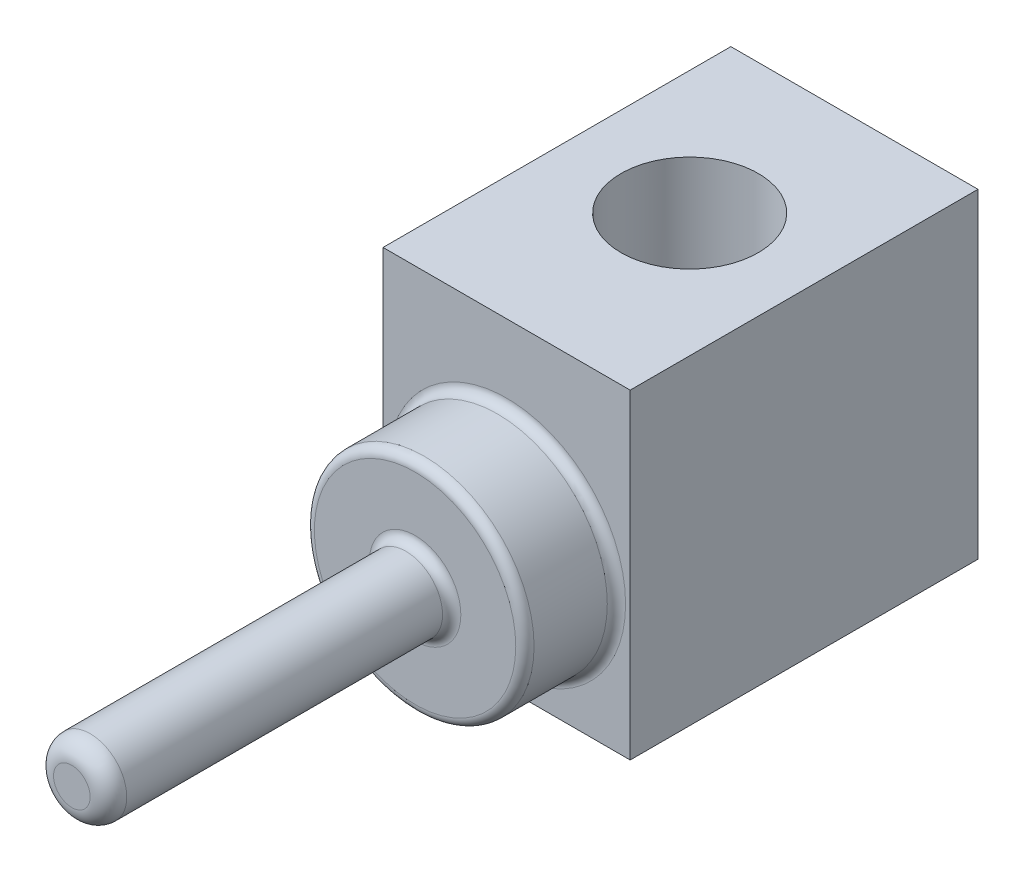
ISO-10303-21;
HEADER;
FILE_DESCRIPTION(('STEP AP214'),'2;1');
FILE_NAME('part.step','',(''),(''),'','','');
FILE_SCHEMA(('AUTOMOTIVE_DESIGN { 1 0 10303 214 1 1 1 1 }'));
ENDSEC;
DATA;
#1=APPLICATION_CONTEXT('core data for automotive mechanical design processes');
#2=APPLICATION_PROTOCOL_DEFINITION('international standard','automotive_design',2000,#1);
#3=PRODUCT_CONTEXT('',#1,'mechanical');
#4=PRODUCT('Part','Part','',(#3));
#5=PRODUCT_RELATED_PRODUCT_CATEGORY('part','',(#4));
#6=PRODUCT_DEFINITION_FORMATION('','',#4);
#7=PRODUCT_DEFINITION_CONTEXT('part definition',#1,'design');
#8=PRODUCT_DEFINITION('design','',#6,#7);
#9=PRODUCT_DEFINITION_SHAPE('','',#8);
#10=(LENGTH_UNIT() NAMED_UNIT(*) SI_UNIT(.MILLI.,.METRE.));
#11=(NAMED_UNIT(*) PLANE_ANGLE_UNIT() SI_UNIT($,.RADIAN.));
#12=(NAMED_UNIT(*) SI_UNIT($,.STERADIAN.) SOLID_ANGLE_UNIT());
#13=UNCERTAINTY_MEASURE_WITH_UNIT(LENGTH_MEASURE(1.E-05),#10,'distance_accuracy_value','');
#14=(GEOMETRIC_REPRESENTATION_CONTEXT(3) GLOBAL_UNCERTAINTY_ASSIGNED_CONTEXT((#13)) GLOBAL_UNIT_ASSIGNED_CONTEXT((#10,
#11,#12)) REPRESENTATION_CONTEXT('',''));
#15=CARTESIAN_POINT('',(0.,0.,0.));
#16=DIRECTION('',(0.,0.,1.));
#17=DIRECTION('',(1.,0.,0.));
#18=AXIS2_PLACEMENT_3D('',#15,#16,#17);
#19=CARTESIAN_POINT('',(0.,-0.3,1.));
#20=DIRECTION('',(0.,0.,1.));
#21=DIRECTION('',(1.,0.,0.));
#22=AXIS2_PLACEMENT_3D('',#19,#20,#21);
#23=PLANE('',#22);
#24=CARTESIAN_POINT('',(0.,-0.3,1.));
#25=DIRECTION('',(0.,0.,1.));
#26=DIRECTION('',(1.,0.,0.));
#27=AXIS2_PLACEMENT_3D('',#24,#25,#26);
#28=CIRCLE('',#27,0.5);
#29=CARTESIAN_POINT('',(0.5,-0.3,1.));
#30=VERTEX_POINT('',#29);
#31=EDGE_CURVE('E166',#30,#30,#28,.F.);
#32=ORIENTED_EDGE('',*,*,#31,.T.);
#33=EDGE_LOOP('',(#32));
#34=FACE_BOUND('',#33,.T.);
#35=CARTESIAN_POINT('',(0.,-0.3,1.));
#36=DIRECTION('',(0.,0.,1.));
#37=DIRECTION('',(1.,0.,0.));
#38=AXIS2_PLACEMENT_3D('',#35,#36,#37);
#39=CIRCLE('',#38,1.1);
#40=CARTESIAN_POINT('',(1.1,-0.3,1.));
#41=VERTEX_POINT('',#40);
#42=EDGE_CURVE('E117',#41,#41,#39,.T.);
#43=ORIENTED_EDGE('',*,*,#42,.T.);
#44=EDGE_LOOP('',(#43));
#45=FACE_BOUND('',#44,.T.);
#46=ADVANCED_FACE('F37',(#34,#45),#23,.T.);
#47=CARTESIAN_POINT('',(0.,0.,0.));
#48=DIRECTION('',(0.,0.,1.));
#49=DIRECTION('',(1.,0.,0.));
#50=AXIS2_PLACEMENT_3D('',#47,#48,#49);
#51=PLANE('',#50);
#52=CARTESIAN_POINT('',(0.,-0.3,0.));
#53=DIRECTION('',(0.,0.,1.));
#54=DIRECTION('',(1.,0.,0.));
#55=AXIS2_PLACEMENT_3D('',#52,#53,#54);
#56=CIRCLE('',#55,1.3);
#57=CARTESIAN_POINT('',(1.3,-0.3,0.));
#58=VERTEX_POINT('',#57);
#59=EDGE_CURVE('E173',#58,#58,#56,.F.);
#60=ORIENTED_EDGE('',*,*,#59,.T.);
#61=EDGE_LOOP('',(#60));
#62=FACE_BOUND('',#61,.T.);
#63=DIRECTION('',(0.,1.,0.));
#64=VECTOR('',#63,1.);
#65=CARTESIAN_POINT('',(1.35,1.75,0.));
#66=LINE('',#65,#64);
#67=CARTESIAN_POINT('',(1.35,-1.75,0.));
#68=VERTEX_POINT('',#67);
#69=CARTESIAN_POINT('',(1.35,1.75,0.));
#70=VERTEX_POINT('',#69);
#71=EDGE_CURVE('E109',#68,#70,#66,.T.);
#72=ORIENTED_EDGE('',*,*,#71,.T.);
#73=DIRECTION('',(-1.,0.,0.));
#74=VECTOR('',#73,1.);
#75=CARTESIAN_POINT('',(-1.35,1.75,0.));
#76=LINE('',#75,#74);
#77=CARTESIAN_POINT('',(-1.35,1.75,0.));
#78=VERTEX_POINT('',#77);
#79=EDGE_CURVE('E111',#70,#78,#76,.T.);
#80=ORIENTED_EDGE('',*,*,#79,.T.);
#81=DIRECTION('',(0.,-1.,0.));
#82=VECTOR('',#81,1.);
#83=CARTESIAN_POINT('',(-1.35,1.75,0.));
#84=LINE('',#83,#82);
#85=CARTESIAN_POINT('',(-1.35,-1.75,0.));
#86=VERTEX_POINT('',#85);
#87=EDGE_CURVE('E72',#78,#86,#84,.T.);
#88=ORIENTED_EDGE('',*,*,#87,.T.);
#89=DIRECTION('',(1.,0.,0.));
#90=VECTOR('',#89,1.);
#91=CARTESIAN_POINT('',(-1.35,-1.75,0.));
#92=LINE('',#91,#90);
#93=EDGE_CURVE('E104',#86,#68,#92,.T.);
#94=ORIENTED_EDGE('',*,*,#93,.T.);
#95=EDGE_LOOP('',(#72,#80,#88,#94));
#96=FACE_BOUND('',#95,.T.);
#97=ADVANCED_FACE('F148',(#62,#96),#51,.T.);
#98=CARTESIAN_POINT('',(1.35,1.75,-3.8));
#99=DIRECTION('',(1.,0.,0.));
#100=DIRECTION('',(0.,1.,0.));
#101=AXIS2_PLACEMENT_3D('',#98,#99,#100);
#102=PLANE('',#101);
#103=DIRECTION('',(0.,0.,1.));
#104=VECTOR('',#103,1.);
#105=CARTESIAN_POINT('',(1.35,1.75,-3.8));
#106=LINE('',#105,#104);
#107=CARTESIAN_POINT('',(1.35,1.75,-3.8));
#108=VERTEX_POINT('',#107);
#109=EDGE_CURVE('E93',#108,#70,#106,.T.);
#110=ORIENTED_EDGE('',*,*,#109,.T.);
#111=ORIENTED_EDGE('',*,*,#71,.F.);
#112=DIRECTION('',(0.,0.,1.));
#113=VECTOR('',#112,1.);
#114=CARTESIAN_POINT('',(1.35,-1.75,-3.8));
#115=LINE('',#114,#113);
#116=CARTESIAN_POINT('',(1.35,-1.75,-3.8));
#117=VERTEX_POINT('',#116);
#118=EDGE_CURVE('E54',#117,#68,#115,.T.);
#119=ORIENTED_EDGE('',*,*,#118,.F.);
#120=DIRECTION('',(0.,1.,0.));
#121=VECTOR('',#120,1.);
#122=CARTESIAN_POINT('',(1.35,1.75,-3.8));
#123=LINE('',#122,#121);
#124=EDGE_CURVE('E80',#117,#108,#123,.T.);
#125=ORIENTED_EDGE('',*,*,#124,.T.);
#126=EDGE_LOOP('',(#110,#111,#119,#125));
#127=FACE_BOUND('',#126,.T.);
#128=ADVANCED_FACE('F198',(#127),#102,.T.);
#129=CARTESIAN_POINT('',(-1.35,-1.75,-3.8));
#130=DIRECTION('',(0.,-1.,0.));
#131=DIRECTION('',(0.,0.,-1.));
#132=AXIS2_PLACEMENT_3D('',#129,#130,#131);
#133=PLANE('',#132);
#134=ORIENTED_EDGE('',*,*,#93,.F.);
#135=DIRECTION('',(0.,0.,1.));
#136=VECTOR('',#135,1.);
#137=CARTESIAN_POINT('',(-1.35,-1.75,-3.8));
#138=LINE('',#137,#136);
#139=CARTESIAN_POINT('',(-1.35,-1.75,-3.8));
#140=VERTEX_POINT('',#139);
#141=EDGE_CURVE('E92',#140,#86,#138,.T.);
#142=ORIENTED_EDGE('',*,*,#141,.F.);
#143=DIRECTION('',(1.,0.,0.));
#144=VECTOR('',#143,1.);
#145=CARTESIAN_POINT('',(-1.35,-1.75,-3.8));
#146=LINE('',#145,#144);
#147=EDGE_CURVE('E100',#140,#117,#146,.T.);
#148=ORIENTED_EDGE('',*,*,#147,.T.);
#149=ORIENTED_EDGE('',*,*,#118,.T.);
#150=EDGE_LOOP('',(#134,#142,#148,#149));
#151=FACE_BOUND('',#150,.T.);
#152=ADVANCED_FACE('F201',(#151),#133,.T.);
#153=CARTESIAN_POINT('',(-1.35,1.75,-3.8));
#154=DIRECTION('',(-1.,0.,0.));
#155=DIRECTION('',(0.,-1.,0.));
#156=AXIS2_PLACEMENT_3D('',#153,#154,#155);
#157=PLANE('',#156);
#158=DIRECTION('',(0.,-1.,0.));
#159=VECTOR('',#158,1.);
#160=CARTESIAN_POINT('',(-1.35,1.75,-3.8));
#161=LINE('',#160,#159);
#162=CARTESIAN_POINT('',(-1.35,1.75,-3.8));
#163=VERTEX_POINT('',#162);
#164=EDGE_CURVE('E87',#163,#140,#161,.T.);
#165=ORIENTED_EDGE('',*,*,#164,.T.);
#166=ORIENTED_EDGE('',*,*,#141,.T.);
#167=ORIENTED_EDGE('',*,*,#87,.F.);
#168=DIRECTION('',(0.,0.,1.));
#169=VECTOR('',#168,1.);
#170=CARTESIAN_POINT('',(-1.35,1.75,-3.8));
#171=LINE('',#170,#169);
#172=EDGE_CURVE('E84',#163,#78,#171,.T.);
#173=ORIENTED_EDGE('',*,*,#172,.F.);
#174=EDGE_LOOP('',(#165,#166,#167,#173));
#175=FACE_BOUND('',#174,.T.);
#176=ADVANCED_FACE('F86',(#175),#157,.T.);
#177=CARTESIAN_POINT('',(-1.35,1.75,-3.8));
#178=DIRECTION('',(0.,1.,0.));
#179=DIRECTION('',(0.,0.,1.));
#180=AXIS2_PLACEMENT_3D('',#177,#178,#179);
#181=PLANE('',#180);
#182=CARTESIAN_POINT('',(0.,1.75,-2.));
#183=DIRECTION('',(0.,1.,0.));
#184=DIRECTION('',(0.,0.,1.));
#185=AXIS2_PLACEMENT_3D('',#182,#183,#184);
#186=CIRCLE('',#185,0.75);
#187=CARTESIAN_POINT('',(0.,1.75,-1.25));
#188=VERTEX_POINT('',#187);
#189=EDGE_CURVE('E127',#188,#188,#186,.T.);
#190=ORIENTED_EDGE('',*,*,#189,.F.);
#191=EDGE_LOOP('',(#190));
#192=FACE_BOUND('',#191,.T.);
#193=ORIENTED_EDGE('',*,*,#79,.F.);
#194=ORIENTED_EDGE('',*,*,#109,.F.);
#195=DIRECTION('',(-1.,0.,0.));
#196=VECTOR('',#195,1.);
#197=CARTESIAN_POINT('',(-1.35,1.75,-3.8));
#198=LINE('',#197,#196);
#199=EDGE_CURVE('E99',#108,#163,#198,.T.);
#200=ORIENTED_EDGE('',*,*,#199,.T.);
#201=ORIENTED_EDGE('',*,*,#172,.T.);
#202=EDGE_LOOP('',(#193,#194,#200,#201));
#203=FACE_BOUND('',#202,.T.);
#204=ADVANCED_FACE('F102',(#192,#203),#181,.T.);
#205=CARTESIAN_POINT('',(0.,0.,-3.8));
#206=DIRECTION('',(0.,0.,1.));
#207=DIRECTION('',(1.,0.,0.));
#208=AXIS2_PLACEMENT_3D('',#205,#206,#207);
#209=PLANE('',#208);
#210=CARTESIAN_POINT('',(0.,-0.3,-3.8));
#211=DIRECTION('',(0.,0.,1.));
#212=DIRECTION('',(1.,0.,0.));
#213=AXIS2_PLACEMENT_3D('',#210,#211,#212);
#214=CIRCLE('',#213,1.);
#215=CARTESIAN_POINT('',(1.,-0.3,-3.8));
#216=VERTEX_POINT('',#215);
#217=EDGE_CURVE('E112',#216,#216,#214,.T.);
#218=ORIENTED_EDGE('',*,*,#217,.T.);
#219=EDGE_LOOP('',(#218));
#220=FACE_BOUND('',#219,.T.);
#221=ORIENTED_EDGE('',*,*,#199,.F.);
#222=ORIENTED_EDGE('',*,*,#124,.F.);
#223=ORIENTED_EDGE('',*,*,#147,.F.);
#224=ORIENTED_EDGE('',*,*,#164,.F.);
#225=EDGE_LOOP('',(#221,#222,#223,#224));
#226=FACE_BOUND('',#225,.T.);
#227=ADVANCED_FACE('F98',(#220,#226),#209,.F.);
#228=CARTESIAN_POINT('',(0.,-0.3,-3.8));
#229=DIRECTION('',(0.,0.,1.));
#230=DIRECTION('',(1.,0.,0.));
#231=AXIS2_PLACEMENT_3D('',#228,#229,#230);
#232=CYLINDRICAL_SURFACE('',#231,1.);
#233=CARTESIAN_POINT('',(0.,0.7,-1.25));
#234=CARTESIAN_POINT('',(0.0366202144012363,0.699995549924329,-1.25000473534807));
#235=CARTESIAN_POINT('',(0.0732831719538211,0.697967650692158,-1.25270313962658));
#236=CARTESIAN_POINT('',(0.145465550551888,0.690033614797004,-1.26333290268625));
#237=CARTESIAN_POINT('',(0.180981860536906,0.684117727976345,-1.27127741771765));
#238=CARTESIAN_POINT('',(0.249618016635631,0.668978221133335,-1.29185662173774));
#239=CARTESIAN_POINT('',(0.282750996692572,0.659774718373225,-1.30446280168529));
#240=CARTESIAN_POINT('',(0.346210978824908,0.638752824883222,-1.33377112720603));
#241=CARTESIAN_POINT('',(0.376538798175682,0.626935199195139,-1.35047207457087));
#242=CARTESIAN_POINT('',(0.436733026399872,0.600247710135603,-1.38913151948125));
#243=CARTESIAN_POINT('',(0.466296630176021,0.585196539347365,-1.41143366835905));
#244=CARTESIAN_POINT('',(0.521513568274128,0.553835092817011,-1.45974791498282));
#245=CARTESIAN_POINT('',(0.547160736840208,0.537522891380569,-1.48576574032586));
#246=CARTESIAN_POINT('',(0.599185812622842,0.501355617071726,-1.54679147793153));
#247=CARTESIAN_POINT('',(0.624652893542543,0.481454274009925,-1.58255183890201));
#248=CARTESIAN_POINT('',(0.669309989447192,0.443557223633513,-1.65872550584258));
#249=CARTESIAN_POINT('',(0.688508584605921,0.425558934483913,-1.69913234842712));
#250=CARTESIAN_POINT('',(0.71440313926206,0.399885775857877,-1.76975141938605));
#251=CARTESIAN_POINT('',(0.723128372337555,0.390788755925942,-1.79869534857622));
#252=CARTESIAN_POINT('',(0.737103362769485,0.375857970761133,-1.85819636738046));
#253=CARTESIAN_POINT('',(0.742361076759834,0.370016739542133,-1.88874958893716));
#254=CARTESIAN_POINT('',(0.749064110723876,0.362518798434896,-1.95109129276563));
#255=CARTESIAN_POINT('',(0.750474774282209,0.360900133439581,-1.98288840335078));
#256=CARTESIAN_POINT('',(0.749241066198164,0.362297658823725,-2.04630745545204));
#257=CARTESIAN_POINT('',(0.746595240758686,0.365315510876204,-2.07792933008898));
#258=CARTESIAN_POINT('',(0.737988696485991,0.374838116502368,-2.13659567366212));
#259=CARTESIAN_POINT('',(0.732412431994231,0.380935785974531,-2.16376818535869));
#260=CARTESIAN_POINT('',(0.718528355694913,0.395570964919252,-2.21671943919577));
#261=CARTESIAN_POINT('',(0.710217918434353,0.404110818431617,-2.24249681386061));
#262=CARTESIAN_POINT('',(0.685165320811544,0.42870884610599,-2.30812819341289));
#263=CARTESIAN_POINT('',(0.666400742456174,0.446128245598029,-2.34670020834748));
#264=CARTESIAN_POINT('',(0.623090116586354,0.482666490824355,-2.41959826190876));
#265=CARTESIAN_POINT('',(0.598530021283118,0.501789394457194,-2.45391366962035));
#266=CARTESIAN_POINT('',(0.543258020506854,0.540258361538407,-2.51887669520899));
#267=CARTESIAN_POINT('',(0.512406877629166,0.559597933643939,-2.54941030344265));
#268=CARTESIAN_POINT('',(0.445211260855806,0.596240189912107,-2.60513182338868));
#269=CARTESIAN_POINT('',(0.408877527147119,0.61354674132054,-2.63032996011473));
#270=CARTESIAN_POINT('',(0.338951040226875,0.641398630366826,-2.66999039962053));
#271=CARTESIAN_POINT('',(0.306269935092756,0.652603854724669,-2.68559229710799));
#272=CARTESIAN_POINT('',(0.238176086601093,0.67186452208511,-2.71211244023183));
#273=CARTESIAN_POINT('',(0.202765070531895,0.679921937521858,-2.72303361924961));
#274=CARTESIAN_POINT('',(0.129838116241743,0.692227943179846,-2.73962668144325));
#275=CARTESIAN_POINT('',(0.092310640702966,0.696452964858719,-2.74526608946932));
#276=CARTESIAN_POINT('',(0.0166006198984609,0.70057941829725,-2.75077479868585));
#277=CARTESIAN_POINT('',(-0.0215816421863622,0.700482674227045,-2.75064653434768));
#278=CARTESIAN_POINT('',(-0.093402108664815,0.69621273587936,-2.74494456536341));
#279=CARTESIAN_POINT('',(-0.127111163773068,0.692450433002003,-2.73991973155566));
#280=CARTESIAN_POINT('',(-0.19305533530456,0.68175660100794,-2.72551310999607));
#281=CARTESIAN_POINT('',(-0.225290136493632,0.674824397536309,-2.71613039515529));
#282=CARTESIAN_POINT('',(-0.288708389844886,0.657999153416566,-2.69305623470345));
#283=CARTESIAN_POINT('',(-0.319814586268069,0.648010251450967,-2.6792244092863));
#284=CARTESIAN_POINT('',(-0.379259263521539,0.625834927059812,-2.6479137722872));
#285=CARTESIAN_POINT('',(-0.407597360668208,0.613648200660336,-2.63043445618013));
#286=CARTESIAN_POINT('',(-0.465755813159513,0.585595734432497,-2.58910837679472));
#287=CARTESIAN_POINT('',(-0.495033381349327,0.569455475125192,-2.56468573028126));
#288=CARTESIAN_POINT('',(-0.549359874279295,0.536194764373915,-2.51199562370581));
#289=CARTESIAN_POINT('',(-0.574399152347978,0.519072192536943,-2.48371965015335));
#290=CARTESIAN_POINT('',(-0.62438770537802,0.481845641457518,-2.41792505951937));
#291=CARTESIAN_POINT('',(-0.648415218243071,0.461793592600648,-2.37967121925368));
#292=CARTESIAN_POINT('',(-0.689616179991866,0.424702956742105,-2.29831996101394));
#293=CARTESIAN_POINT('',(-0.706810002579291,0.407655497854296,-2.25523743904634));
#294=CARTESIAN_POINT('',(-0.728078671282801,0.385594389043247,-2.18229277556238));
#295=CARTESIAN_POINT('',(-0.734655047561809,0.378479059123847,-2.15380443679764));
#296=CARTESIAN_POINT('',(-0.744457610912695,0.367710280514029,-2.09564647650957));
#297=CARTESIAN_POINT('',(-0.747691276007807,0.364049106097411,-2.06597964660315));
#298=CARTESIAN_POINT('',(-0.750576601033655,0.360788008964814,-2.00608546009004));
#299=CARTESIAN_POINT('',(-0.750210076582722,0.361208703438968,-1.97585602847917));
#300=CARTESIAN_POINT('',(-0.74588441923474,0.36608224270422,-1.91597158063999));
#301=CARTESIAN_POINT('',(-0.741920650285916,0.370540290734719,-1.88631735611138));
#302=CARTESIAN_POINT('',(-0.729469208900039,0.384086744053065,-1.8220427142215));
#303=CARTESIAN_POINT('',(-0.720182838954333,0.393973530017116,-1.78775140963312));
#304=CARTESIAN_POINT('',(-0.697348137148892,0.416914816662478,-1.72173257588601));
#305=CARTESIAN_POINT('',(-0.683789039566413,0.42997729973955,-1.69001178011397));
#306=CARTESIAN_POINT('',(-0.647494590522783,0.462582387984412,-1.61873968323072));
#307=CARTESIAN_POINT('',(-0.62320769235656,0.482801021766621,-1.58028920200535));
#308=CARTESIAN_POINT('',(-0.568253610319043,0.52356754509007,-1.50843698413391));
#309=CARTESIAN_POINT('',(-0.53758074162965,0.54411571283823,-1.47503979200132));
#310=CARTESIAN_POINT('',(-0.469813504073434,0.583644966812501,-1.41358405367889));
#311=CARTESIAN_POINT('',(-0.432668324359605,0.602611751461281,-1.38557174591106));
#312=CARTESIAN_POINT('',(-0.35257980527157,0.636786365634487,-1.33638856860002));
#313=CARTESIAN_POINT('',(-0.309650664114993,0.652003149546709,-1.31520136389219));
#314=CARTESIAN_POINT('',(-0.232419470733686,0.673183741180643,-1.28610004121395));
#315=CARTESIAN_POINT('',(-0.19927463266858,0.680552315625429,-1.27611583370066));
#316=CARTESIAN_POINT('',(-0.131422973804692,0.691917998699978,-1.26079184705597));
#317=CARTESIAN_POINT('',(-0.0967208035042929,0.695924522226515,-1.25543909693557));
#318=CARTESIAN_POINT('',(-0.0412269601856745,0.699363449511954,-1.25084873150009));
#319=CARTESIAN_POINT('',(-0.020620256240996,0.70000250576634,-1.24999733360134));
#320=CARTESIAN_POINT('',(0.,0.7,-1.25));
#321=B_SPLINE_CURVE_WITH_KNOTS('',3,(#233,#234,#235,#236,#237,#238,#239,#240,#241,#242,#243,
#244,#245,#246,#247,#248,#249,#250,#251,#252,#253,#254,#255,#256,#257,#258,#259,#260,#261,#262,
#263,#264,#265,#266,#267,#268,#269,#270,#271,#272,#273,#274,#275,#276,#277,#278,#279,#280,#281,
#282,#283,#284,#285,#286,#287,#288,#289,#290,#291,#292,#293,#294,#295,#296,#297,#298,#299,#300,
#301,#302,#303,#304,#305,#306,#307,#308,#309,#310,#311,#312,#313,#314,#315,#316,#317,#318,#319,
#320),.UNSPECIFIED.,.T.,.F.,(4,2,2,2,2,2,2,2,2,2,2,2,2,2,2,2,2,2,2,2,2,2,2,2,2,2,2,2,2,2,2,2,2,
2,2,2,2,2,2,2,2,2,2,4),(0.,0.109785893286021,0.219848159711622,0.329248166786691,
0.438616199424646,0.558112156587148,0.677794342025812,0.821800079437255,0.965607870282533,
1.05999759264951,1.15416996597645,1.24918793810628,1.34423997150105,1.42913445078177,
1.51411068794507,1.65224665897142,1.79072096173131,1.93267941963232,2.07436331241032,
2.18763252497381,2.30083064815745,2.41472029077636,2.52856186227493,2.63095593500184,
2.73337180087093,2.83940219736027,2.94544726982957,3.06920191035121,3.19323454486913,
3.3408429800216,3.48800797919243,3.57794580705653,3.66768199551291,3.75787166921557,
3.84817774276114,3.95819835474254,4.06849842564147,4.21706123322071,4.36575686189633,
4.51567724740512,4.66523610130769,4.77097848765001,4.87642376135815,4.93824243959963),.UNSPECIFIED.);
#322=CARTESIAN_POINT('',(0.,0.7,-1.25));
#323=VERTEX_POINT('',#322);
#324=EDGE_CURVE('E120',#323,#323,#321,.T.);
#325=ORIENTED_EDGE('',*,*,#324,.T.);
#326=EDGE_LOOP('',(#325));
#327=FACE_BOUND('',#326,.T.);
#328=ORIENTED_EDGE('',*,*,#217,.F.);
#329=EDGE_LOOP('',(#328));
#330=FACE_BOUND('',#329,.T.);
#331=CARTESIAN_POINT('',(0.,-0.3,0.));
#332=DIRECTION('',(0.,0.,1.));
#333=DIRECTION('',(1.,0.,0.));
#334=AXIS2_PLACEMENT_3D('',#331,#332,#333);
#335=CIRCLE('',#334,1.);
#336=CARTESIAN_POINT('',(1.,-0.3,0.));
#337=VERTEX_POINT('',#336);
#338=EDGE_CURVE('E223',#337,#337,#335,.F.);
#339=ORIENTED_EDGE('',*,*,#338,.F.);
#340=EDGE_LOOP('',(#339));
#341=FACE_BOUND('',#340,.T.);
#342=ADVANCED_FACE('F129',(#327,#330,#341),#232,.F.);
#343=CARTESIAN_POINT('',(0.,-0.0999999999999983,-2.));
#344=DIRECTION('',(0.,1.,0.));
#345=DIRECTION('',(0.,0.,1.));
#346=AXIS2_PLACEMENT_3D('',#343,#344,#345);
#347=CYLINDRICAL_SURFACE('',#346,0.75);
#348=ORIENTED_EDGE('',*,*,#189,.T.);
#349=EDGE_LOOP('',(#348));
#350=FACE_BOUND('',#349,.T.);
#351=ORIENTED_EDGE('',*,*,#324,.F.);
#352=EDGE_LOOP('',(#351));
#353=FACE_BOUND('',#352,.T.);
#354=ADVANCED_FACE('F132',(#350,#353),#347,.F.);
#355=CARTESIAN_POINT('',(0.,-0.3,0.));
#356=DIRECTION('',(0.,0.,1.));
#357=DIRECTION('',(1.,0.,0.));
#358=AXIS2_PLACEMENT_3D('',#355,#356,#357);
#359=PLANE('',#358);
#360=ORIENTED_EDGE('',*,*,#338,.T.);
#361=EDGE_LOOP('',(#360));
#362=FACE_BOUND('',#361,.T.);
#363=ADVANCED_FACE('F136',(#362),#359,.F.);
#364=CARTESIAN_POINT('',(0.,-0.3,1.));
#365=DIRECTION('',(0.,0.,-1.));
#366=DIRECTION('',(-1.,0.,0.));
#367=AXIS2_PLACEMENT_3D('',#364,#365,#366);
#368=CYLINDRICAL_SURFACE('',#367,1.2);
#369=CARTESIAN_POINT('',(0.,-0.3,0.1));
#370=DIRECTION('',(0.,0.,1.));
#371=DIRECTION('',(1.,0.,0.));
#372=AXIS2_PLACEMENT_3D('',#369,#370,#371);
#373=CIRCLE('',#372,1.2);
#374=CARTESIAN_POINT('',(1.2,-0.3,0.1));
#375=VERTEX_POINT('',#374);
#376=EDGE_CURVE('E176',#375,#375,#373,.T.);
#377=ORIENTED_EDGE('',*,*,#376,.T.);
#378=EDGE_LOOP('',(#377));
#379=FACE_BOUND('',#378,.T.);
#380=CARTESIAN_POINT('',(0.,-0.3,0.9));
#381=DIRECTION('',(0.,0.,1.));
#382=DIRECTION('',(1.,0.,0.));
#383=AXIS2_PLACEMENT_3D('',#380,#381,#382);
#384=CIRCLE('',#383,1.2);
#385=CARTESIAN_POINT('',(1.2,-0.3,0.9));
#386=VERTEX_POINT('',#385);
#387=EDGE_CURVE('E178',#386,#386,#384,.F.);
#388=ORIENTED_EDGE('',*,*,#387,.T.);
#389=EDGE_LOOP('',(#388));
#390=FACE_BOUND('',#389,.T.);
#391=ADVANCED_FACE('F138',(#379,#390),#368,.T.);
#392=CARTESIAN_POINT('',(0.,-0.3,4.75));
#393=DIRECTION('',(0.,0.,-1.));
#394=DIRECTION('',(-1.,0.,0.));
#395=AXIS2_PLACEMENT_3D('',#392,#393,#394);
#396=CYLINDRICAL_SURFACE('',#395,0.4);
#397=CARTESIAN_POINT('',(0.,-0.3,4.55));
#398=DIRECTION('',(0.,0.,1.));
#399=DIRECTION('',(1.,0.,0.));
#400=AXIS2_PLACEMENT_3D('',#397,#398,#399);
#401=CIRCLE('',#400,0.4);
#402=CARTESIAN_POINT('',(0.4,-0.3,4.55));
#403=VERTEX_POINT('',#402);
#404=EDGE_CURVE('E12',#403,#403,#401,.F.);
#405=ORIENTED_EDGE('',*,*,#404,.T.);
#406=EDGE_LOOP('',(#405));
#407=FACE_BOUND('',#406,.T.);
#408=CARTESIAN_POINT('',(0.,-0.3,1.1));
#409=DIRECTION('',(0.,0.,1.));
#410=DIRECTION('',(1.,0.,0.));
#411=AXIS2_PLACEMENT_3D('',#408,#409,#410);
#412=CIRCLE('',#411,0.4);
#413=CARTESIAN_POINT('',(0.4,-0.3,1.1));
#414=VERTEX_POINT('',#413);
#415=EDGE_CURVE('E168',#414,#414,#412,.T.);
#416=ORIENTED_EDGE('',*,*,#415,.T.);
#417=EDGE_LOOP('',(#416));
#418=FACE_BOUND('',#417,.T.);
#419=ADVANCED_FACE('F141',(#407,#418),#396,.T.);
#420=CARTESIAN_POINT('',(0.,-0.3,4.75));
#421=DIRECTION('',(0.,0.,1.));
#422=DIRECTION('',(1.,0.,0.));
#423=AXIS2_PLACEMENT_3D('',#420,#421,#422);
#424=PLANE('',#423);
#425=CARTESIAN_POINT('',(0.,-0.3,4.75));
#426=DIRECTION('',(0.,0.,1.));
#427=DIRECTION('',(1.,0.,0.));
#428=AXIS2_PLACEMENT_3D('',#425,#426,#427);
#429=CIRCLE('',#428,0.2);
#430=CARTESIAN_POINT('',(0.2,-0.3,4.75));
#431=VERTEX_POINT('',#430);
#432=EDGE_CURVE('E46',#431,#431,#429,.T.);
#433=ORIENTED_EDGE('',*,*,#432,.T.);
#434=EDGE_LOOP('',(#433));
#435=FACE_BOUND('',#434,.T.);
#436=ADVANCED_FACE('F152',(#435),#424,.T.);
#437=CARTESIAN_POINT('',(0.,-0.3,0.9));
#438=DIRECTION('',(0.,0.,1.));
#439=DIRECTION('',(1.,0.,0.));
#440=AXIS2_PLACEMENT_3D('',#437,#438,#439);
#441=TOROIDAL_SURFACE('',#440,1.1,0.1);
#442=ORIENTED_EDGE('',*,*,#387,.F.);
#443=EDGE_LOOP('',(#442));
#444=FACE_BOUND('',#443,.T.);
#445=ORIENTED_EDGE('',*,*,#42,.F.);
#446=EDGE_LOOP('',(#445));
#447=FACE_BOUND('',#446,.T.);
#448=ADVANCED_FACE('F155',(#444,#447),#441,.T.);
#449=CARTESIAN_POINT('',(0.,-0.3,0.1));
#450=DIRECTION('',(0.,0.,1.));
#451=DIRECTION('',(1.,0.,0.));
#452=AXIS2_PLACEMENT_3D('',#449,#450,#451);
#453=TOROIDAL_SURFACE('',#452,1.3,0.1);
#454=ORIENTED_EDGE('',*,*,#59,.F.);
#455=EDGE_LOOP('',(#454));
#456=FACE_BOUND('',#455,.T.);
#457=ORIENTED_EDGE('',*,*,#376,.F.);
#458=EDGE_LOOP('',(#457));
#459=FACE_BOUND('',#458,.T.);
#460=ADVANCED_FACE('F160',(#456,#459),#453,.F.);
#461=CARTESIAN_POINT('',(0.,-0.3,1.1));
#462=DIRECTION('',(0.,0.,1.));
#463=DIRECTION('',(1.,0.,0.));
#464=AXIS2_PLACEMENT_3D('',#461,#462,#463);
#465=TOROIDAL_SURFACE('',#464,0.5,0.1);
#466=ORIENTED_EDGE('',*,*,#31,.F.);
#467=EDGE_LOOP('',(#466));
#468=FACE_BOUND('',#467,.T.);
#469=ORIENTED_EDGE('',*,*,#415,.F.);
#470=EDGE_LOOP('',(#469));
#471=FACE_BOUND('',#470,.T.);
#472=ADVANCED_FACE('F189',(#468,#471),#465,.F.);
#473=CARTESIAN_POINT('',(0.,-0.3,4.55));
#474=DIRECTION('',(0.,0.,1.));
#475=DIRECTION('',(1.,0.,0.));
#476=AXIS2_PLACEMENT_3D('',#473,#474,#475);
#477=DEGENERATE_TOROIDAL_SURFACE('',#476,0.2,0.2,.T.);
#478=ORIENTED_EDGE('',*,*,#404,.F.);
#479=EDGE_LOOP('',(#478));
#480=FACE_BOUND('',#479,.T.);
#481=ORIENTED_EDGE('',*,*,#432,.F.);
#482=EDGE_LOOP('',(#481));
#483=FACE_BOUND('',#482,.T.);
#484=ADVANCED_FACE('F39',(#480,#483),#477,.T.);
#485=CLOSED_SHELL('',(#46,#97,#128,#152,#176,#204,#227,#342,#354,#363,#391,#419,#436,#448,#460,
#472,#484));
#486=MANIFOLD_SOLID_BREP('B2',#485);
#487=ADVANCED_BREP_SHAPE_REPRESENTATION('',(#18,#486),#14);
#488=SHAPE_DEFINITION_REPRESENTATION(#9,#487);
ENDSEC;
END-ISO-10303-21;
